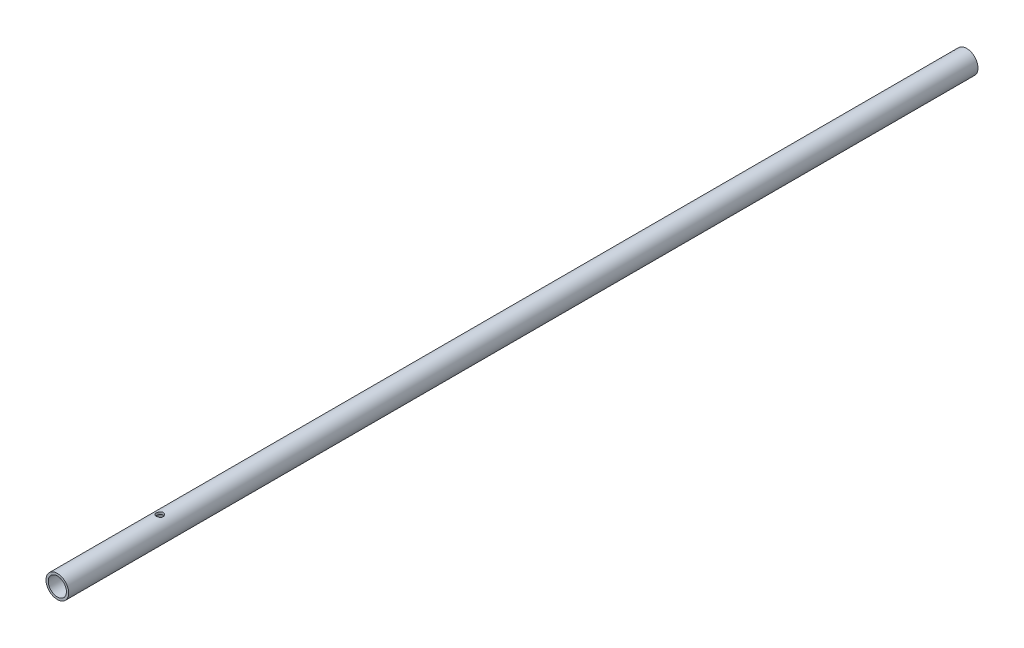
ISO-10303-21;
HEADER;
FILE_DESCRIPTION(('STEP AP214'),'2;1');
FILE_NAME('part.step','',(''),(''),'','','');
FILE_SCHEMA(('AUTOMOTIVE_DESIGN { 1 0 10303 214 1 1 1 1 }'));
ENDSEC;
DATA;
#1=APPLICATION_CONTEXT('core data for automotive mechanical design processes');
#2=APPLICATION_PROTOCOL_DEFINITION('international standard','automotive_design',2000,#1);
#3=PRODUCT_CONTEXT('',#1,'mechanical');
#4=PRODUCT('Part','Part','',(#3));
#5=PRODUCT_RELATED_PRODUCT_CATEGORY('part','',(#4));
#6=PRODUCT_DEFINITION_FORMATION('','',#4);
#7=PRODUCT_DEFINITION_CONTEXT('part definition',#1,'design');
#8=PRODUCT_DEFINITION('design','',#6,#7);
#9=PRODUCT_DEFINITION_SHAPE('','',#8);
#10=(LENGTH_UNIT() NAMED_UNIT(*) SI_UNIT(.MILLI.,.METRE.));
#11=(NAMED_UNIT(*) PLANE_ANGLE_UNIT() SI_UNIT($,.RADIAN.));
#12=(NAMED_UNIT(*) SI_UNIT($,.STERADIAN.) SOLID_ANGLE_UNIT());
#13=UNCERTAINTY_MEASURE_WITH_UNIT(LENGTH_MEASURE(1.E-05),#10,'distance_accuracy_value','');
#14=(GEOMETRIC_REPRESENTATION_CONTEXT(3) GLOBAL_UNCERTAINTY_ASSIGNED_CONTEXT((#13)) GLOBAL_UNIT_ASSIGNED_CONTEXT((#10,
#11,#12)) REPRESENTATION_CONTEXT('',''));
#15=CARTESIAN_POINT('',(0.,0.,0.));
#16=DIRECTION('',(0.,0.,1.));
#17=DIRECTION('',(1.,0.,0.));
#18=AXIS2_PLACEMENT_3D('',#15,#16,#17);
#19=CARTESIAN_POINT('',(0.,0.,400.));
#20=DIRECTION('',(0.,0.,-1.));
#21=DIRECTION('',(-1.,0.,0.));
#22=AXIS2_PLACEMENT_3D('',#19,#20,#21);
#23=CYLINDRICAL_SURFACE('',#22,5.);
#24=CARTESIAN_POINT('',(0.,-5.,32.8344084314313));
#25=CARTESIAN_POINT('',(0.0822886127559416,-4.9999992925055,32.8344074339464));
#26=CARTESIAN_POINT('',(0.16458731835681,-4.9979491569394,32.8276145678071));
#27=CARTESIAN_POINT('',(0.326788125315354,-4.98997105593627,32.8006870772081));
#28=CARTESIAN_POINT('',(0.406689504424447,-4.9840419338959,32.7805484734063));
#29=CARTESIAN_POINT('',(0.561732707772502,-4.96895552501637,32.7276624145178));
#30=CARTESIAN_POINT('',(0.636881364415743,-4.95980300250167,32.6949335618081));
#31=CARTESIAN_POINT('',(0.780624181078093,-4.93922109237254,32.6178723383689));
#32=CARTESIAN_POINT('',(0.849217467496828,-4.92779140191602,32.5735384240281));
#33=CARTESIAN_POINT('',(0.979871797215218,-4.90350737192149,32.4731844239477));
#34=CARTESIAN_POINT('',(1.04171807127791,-4.89062383656324,32.4168918055327));
#35=CARTESIAN_POINT('',(1.1552492092707,-4.86505834209555,32.2947992015046));
#36=CARTESIAN_POINT('',(1.20693236331366,-4.85237641723527,32.2289976192878));
#37=CARTESIAN_POINT('',(1.29980037727968,-4.82834113992627,32.0879376783705));
#38=CARTESIAN_POINT('',(1.34072309026627,-4.81702406662648,32.0124999704149));
#39=CARTESIAN_POINT('',(1.40921394779434,-4.79743620392659,31.85541917717));
#40=CARTESIAN_POINT('',(1.43678529924754,-4.78916468311877,31.7737775874695));
#41=CARTESIAN_POINT('',(1.4770163368759,-4.77690870836908,31.6090181652614));
#42=CARTESIAN_POINT('',(1.4900719623967,-4.77281069322975,31.5260056875251));
#43=CARTESIAN_POINT('',(1.50213730619726,-4.76902789748175,31.3588752751668));
#44=CARTESIAN_POINT('',(1.5011504276614,-4.76934204758978,31.2747576133216));
#45=CARTESIAN_POINT('',(1.48546977204844,-4.77424744066212,31.1110245227669));
#46=CARTESIAN_POINT('',(1.47127205267687,-4.77868388597601,31.0313561810107));
#47=CARTESIAN_POINT('',(1.43037420431961,-4.7910835622716,30.8755886450947));
#48=CARTESIAN_POINT('',(1.4036728414648,-4.79904714130936,30.7994898039914));
#49=CARTESIAN_POINT('',(1.33816026658355,-4.81772733073676,30.6518080817004));
#50=CARTESIAN_POINT('',(1.29918816939214,-4.82848016114723,30.5803013474035));
#51=CARTESIAN_POINT('',(1.21035222593019,-4.85150986998984,30.4446764093442));
#52=CARTESIAN_POINT('',(1.16048574006791,-4.8637871174599,30.3805600019385));
#53=CARTESIAN_POINT('',(1.0488129076943,-4.88911011297106,30.258722240586));
#54=CARTESIAN_POINT('',(0.986594907503921,-4.90216654309757,30.2013797673162));
#55=CARTESIAN_POINT('',(0.853263259346794,-4.92712244062693,30.0978544472777));
#56=CARTESIAN_POINT('',(0.782149051891485,-4.93902183517929,30.0516723029258));
#57=CARTESIAN_POINT('',(0.63235503836856,-4.96043160069146,29.9715485088722));
#58=CARTESIAN_POINT('',(0.55362774977109,-4.96992543668061,29.9376909150857));
#59=CARTESIAN_POINT('',(0.391245415621183,-4.98533521832088,29.8838088412335));
#60=CARTESIAN_POINT('',(0.307591751604387,-4.99125216186913,29.8637805027997));
#61=CARTESIAN_POINT('',(0.140952242677567,-4.99868364643517,29.8387562534315));
#62=CARTESIAN_POINT('',(0.0580500976077211,-5.00034850417787,29.8332468455288));
#63=CARTESIAN_POINT('',(-0.107499605822289,-4.99952923241766,29.8359775870421));
#64=CARTESIAN_POINT('',(-0.190147196692424,-4.99704565677755,29.8442159009814));
#65=CARTESIAN_POINT('',(-0.350903605316557,-4.98830696987119,29.8737930424419));
#66=CARTESIAN_POINT('',(-0.429072772623513,-4.9821382979934,29.8948318189117));
#67=CARTESIAN_POINT('',(-0.580754638968729,-4.9667434784137,29.9490516641101));
#68=CARTESIAN_POINT('',(-0.654266777042172,-4.95751696320869,29.9822341923705));
#69=CARTESIAN_POINT('',(-0.796437189482378,-4.93669654350984,30.0606615968156));
#70=CARTESIAN_POINT('',(-0.864943826223342,-4.92505280829262,30.1061677722836));
#71=CARTESIAN_POINT('',(-0.993523308008304,-4.9007346876375,30.207633185391));
#72=CARTESIAN_POINT('',(-1.05359403238623,-4.88806004430429,30.2635950432273));
#73=CARTESIAN_POINT('',(-1.16585744554482,-4.86253171868313,30.3867957397124));
#74=CARTESIAN_POINT('',(-1.21768481235166,-4.8496882503235,30.4543703071168));
#75=CARTESIAN_POINT('',(-1.30928995076197,-4.82576515237369,30.597536370363));
#76=CARTESIAN_POINT('',(-1.34906803833687,-4.81468547653471,30.6731276559101));
#77=CARTESIAN_POINT('',(-1.41517347131687,-4.79567189613723,30.8299409226116));
#78=CARTESIAN_POINT('',(-1.441563469417,-4.78772337842427,30.9111346178962));
#79=CARTESIAN_POINT('',(-1.48021730819977,-4.77591594361287,31.0770964002966));
#80=CARTESIAN_POINT('',(-1.49248598983725,-4.77205562506754,31.1618632521557));
#81=CARTESIAN_POINT('',(-1.50221984490113,-4.76899972494495,31.3287699497499));
#82=CARTESIAN_POINT('',(-1.50028055313576,-4.76961647441154,31.4108720823939));
#83=CARTESIAN_POINT('',(-1.48307505449922,-4.77499401286707,31.5735225347544));
#84=CARTESIAN_POINT('',(-1.46780938129816,-4.77975463590985,31.6540709165606));
#85=CARTESIAN_POINT('',(-1.42476888809181,-4.79275763668886,31.8103538305322));
#86=CARTESIAN_POINT('',(-1.3971517551207,-4.8009560454451,31.8861357187535));
#87=CARTESIAN_POINT('',(-1.33031507126012,-4.81990278907789,32.0320508702142));
#88=CARTESIAN_POINT('',(-1.29109329967683,-4.83065161193028,32.1021830490396));
#89=CARTESIAN_POINT('',(-1.20048763809684,-4.85397676424694,32.2375715479307));
#90=CARTESIAN_POINT('',(-1.14871276097482,-4.8666054016274,32.3025571926664));
#91=CARTESIAN_POINT('',(-1.03517434633989,-4.89201320449137,32.4231109297184));
#92=CARTESIAN_POINT('',(-0.973408217174995,-4.90479240823104,32.4786765708805));
#93=CARTESIAN_POINT('',(-0.839465762220022,-4.92950936570026,32.580431843712));
#94=CARTESIAN_POINT('',(-0.767037885825208,-4.94141159765141,32.6262998782746));
#95=CARTESIAN_POINT('',(-0.615141374013429,-4.96260680455446,32.7051436013268));
#96=CARTESIAN_POINT('',(-0.535676053026328,-4.97190099930776,32.738125319699));
#97=CARTESIAN_POINT('',(-0.380757712676125,-4.98602174969148,32.7873037070804));
#98=CARTESIAN_POINT('',(-0.30578696197103,-4.99122027380971,32.8049201043123));
#99=CARTESIAN_POINT('',(-0.153880195239277,-4.99820944494472,32.8284719566724));
#100=CARTESIAN_POINT('',(-0.0769445098623873,-5.0000006615474,32.8344093641361));
#101=CARTESIAN_POINT('',(0.,-5.,32.8344084314313));
#102=B_SPLINE_CURVE_WITH_KNOTS('',3,(#24,#25,#26,#27,#28,#29,#30,#31,#32,#33,#34,#35,#36,#37,
#38,#39,#40,#41,#42,#43,#44,#45,#46,#47,#48,#49,#50,#51,#52,#53,#54,#55,#56,#57,#58,#59,#60,#61,
#62,#63,#64,#65,#66,#67,#68,#69,#70,#71,#72,#73,#74,#75,#76,#77,#78,#79,#80,#81,#82,#83,#84,#85,
#86,#87,#88,#89,#90,#91,#92,#93,#94,#95,#96,#97,#98,#99,#100,#101),.UNSPECIFIED.,.T.,.F.,(4,2,2,
2,2,2,2,2,2,2,2,2,2,2,2,2,2,2,2,2,2,2,2,2,2,2,2,2,2,2,2,2,2,2,2,2,2,2,4),(0.,0.24658320362052,
0.493239964861809,0.739533676324558,0.985860164444261,1.23855602952195,1.49129437293484,
1.7497148100987,2.00807314549895,2.25919689364112,2.51025978327442,2.75226016706772,
2.99428443667839,3.23962426457728,3.48502360169935,3.74067104060422,3.99633456544203,
4.25371046895724,4.51101453543746,4.75908809454297,5.00712853566892,5.24956746699643,
5.49203554611796,5.74011305721769,5.98825282019846,6.24540400343361,6.50254844274111,
6.75847814973581,7.01432009483509,7.25950155490956,7.504673196864,7.74680040428258,
7.98897397579381,8.2399692570702,8.49102974925408,8.74942996185483,9.00770911624955,
9.23831691961452,9.46888616981139),.UNSPECIFIED.);
#103=CARTESIAN_POINT('',(0.,-5.,32.8344084314313));
#104=VERTEX_POINT('',#103);
#105=EDGE_CURVE('E68',#104,#104,#102,.T.);
#106=ORIENTED_EDGE('',*,*,#105,.T.);
#107=EDGE_LOOP('',(#106));
#108=FACE_BOUND('',#107,.T.);
#109=CARTESIAN_POINT('',(0.,0.,400.));
#110=DIRECTION('',(0.,0.,1.));
#111=DIRECTION('',(1.,0.,0.));
#112=AXIS2_PLACEMENT_3D('',#109,#110,#111);
#113=CIRCLE('',#112,5.);
#114=CARTESIAN_POINT('',(5.,0.,400.));
#115=VERTEX_POINT('',#114);
#116=EDGE_CURVE('E10',#115,#115,#113,.T.);
#117=ORIENTED_EDGE('',*,*,#116,.F.);
#118=EDGE_LOOP('',(#117));
#119=FACE_BOUND('',#118,.T.);
#120=CARTESIAN_POINT('',(0.,0.,0.));
#121=DIRECTION('',(0.,0.,1.));
#122=DIRECTION('',(1.,0.,0.));
#123=AXIS2_PLACEMENT_3D('',#120,#121,#122);
#124=CIRCLE('',#123,5.);
#125=CARTESIAN_POINT('',(5.,0.,0.));
#126=VERTEX_POINT('',#125);
#127=EDGE_CURVE('E52',#126,#126,#124,.T.);
#128=ORIENTED_EDGE('',*,*,#127,.T.);
#129=EDGE_LOOP('',(#128));
#130=FACE_BOUND('',#129,.T.);
#131=CARTESIAN_POINT('',(0.,5.,353.5));
#132=CARTESIAN_POINT('',(-0.0822886127533016,4.9999992925055,353.500000997485));
#133=CARTESIAN_POINT('',(-0.164587318351532,4.99794915693954,353.506793863624));
#134=CARTESIAN_POINT('',(-0.326788125304881,4.98997105593691,353.533721354222));
#135=CARTESIAN_POINT('',(-0.406689504411417,4.98404193389692,353.553859958023));
#136=CARTESIAN_POINT('',(-0.561732707754523,4.96895552501836,353.60674601691));
#137=CARTESIAN_POINT('',(-0.636881364395372,4.95980300250425,353.639474869619));
#138=CARTESIAN_POINT('',(-0.780624181053131,4.93922109237645,353.716536093056));
#139=CARTESIAN_POINT('',(-0.849217467469667,4.92779140192067,353.760870007395));
#140=CARTESIAN_POINT('',(-0.979871797183748,4.90350737192774,353.861224007473));
#141=CARTESIAN_POINT('',(-1.04171807124435,4.89062383657036,353.917516625886));
#142=CARTESIAN_POINT('',(-1.15524920923325,4.86505834210442,354.03960922991));
#143=CARTESIAN_POINT('',(-1.20693236327442,4.85237641724501,354.105410812125));
#144=CARTESIAN_POINT('',(-1.29980037723708,4.82834113993772,354.246470753038));
#145=CARTESIAN_POINT('',(-1.34072309022213,4.81702406663875,354.321908460991));
#146=CARTESIAN_POINT('',(-1.40921394774758,4.79743620394032,354.47898925423));
#147=CARTESIAN_POINT('',(-1.43678529919972,4.78916468313311,354.560630843928));
#148=CARTESIAN_POINT('',(-1.47701633682652,4.77690870838434,354.72539026613));
#149=CARTESIAN_POINT('',(-1.49007196234678,4.77281069324533,354.808402743864));
#150=CARTESIAN_POINT('',(-1.50213730614672,4.76902789749767,354.975533156217));
#151=CARTESIAN_POINT('',(-1.50115042761078,4.76934204760571,355.059650818059));
#152=CARTESIAN_POINT('',(-1.48546977199811,4.77424744067778,355.223383908608));
#153=CARTESIAN_POINT('',(-1.47127205262685,4.77868388599141,355.303052250362));
#154=CARTESIAN_POINT('',(-1.43037420427055,4.79108356228624,355.458819786273));
#155=CARTESIAN_POINT('',(-1.4036728414164,4.79904714132351,355.534918627374));
#156=CARTESIAN_POINT('',(-1.3381602665368,4.81772733074973,355.682600349661));
#157=CARTESIAN_POINT('',(-1.29918816934641,4.82848016115953,355.754107083955));
#158=CARTESIAN_POINT('',(-1.21035222588682,4.85150987000065,355.88973202201));
#159=CARTESIAN_POINT('',(-1.16048574002588,4.86378711746991,355.953848429414));
#160=CARTESIAN_POINT('',(-1.04881290765546,4.88911011297937,356.075686190762));
#161=CARTESIAN_POINT('',(-0.98659490746696,4.90216654310498,356.13302866403));
#162=CARTESIAN_POINT('',(-0.853263259313964,4.92712244063259,356.236553984064));
#163=CARTESIAN_POINT('',(-0.782149051860902,4.9390218351841,356.282736128414));
#164=CARTESIAN_POINT('',(-0.632355038342826,4.9604316006947,356.362859922465));
#165=CARTESIAN_POINT('',(-0.553627749747965,4.96992543668314,356.39671751625));
#166=CARTESIAN_POINT('',(-0.391245415603524,4.98533521832222,356.4505995901));
#167=CARTESIAN_POINT('',(-0.307591751589584,4.99125216186999,356.470627928532));
#168=CARTESIAN_POINT('',(-0.140952242668334,4.99868364643538,356.495652177899));
#169=CARTESIAN_POINT('',(-0.058050097601192,5.0003485041779,356.501161585802));
#170=CARTESIAN_POINT('',(0.107499605823375,4.9995292324176,356.498430844288));
#171=CARTESIAN_POINT('',(0.190147196690773,4.99704565677756,356.490192530349));
#172=CARTESIAN_POINT('',(0.350903605309678,4.98830696987163,356.460615388889));
#173=CARTESIAN_POINT('',(0.429072772614139,4.98213829799417,356.439576612419));
#174=CARTESIAN_POINT('',(0.580754638954494,4.96674347841533,356.385356767222));
#175=CARTESIAN_POINT('',(0.654266777025569,4.95751696321085,356.352174238962));
#176=CARTESIAN_POINT('',(0.796437189461043,4.93669654351325,356.273746834519));
#177=CARTESIAN_POINT('',(0.864943826199653,4.92505280829675,356.228240659052));
#178=CARTESIAN_POINT('',(0.993523307980123,4.90073468764318,356.126775245947));
#179=CARTESIAN_POINT('',(1.05359403235591,4.8880600443108,356.070813388112));
#180=CARTESIAN_POINT('',(1.16585744551025,4.86253171869138,355.947612691631));
#181=CARTESIAN_POINT('',(1.21768481231502,4.84968825033268,355.880038124228));
#182=CARTESIAN_POINT('',(1.30928995072152,4.82576515238464,355.736872060986));
#183=CARTESIAN_POINT('',(1.34906803829472,4.81468547654651,355.661280775442));
#184=CARTESIAN_POINT('',(1.41517347127168,4.79567189615055,355.504467508745));
#185=CARTESIAN_POINT('',(1.44156346937049,4.78772337843827,355.423273813463));
#186=CARTESIAN_POINT('',(1.48021730815114,4.77591594362794,355.257312031069));
#187=CARTESIAN_POINT('',(1.49248598978779,4.772055625083,355.172545179212));
#188=CARTESIAN_POINT('',(1.50221984485059,4.76899972496087,355.005638481624));
#189=CARTESIAN_POINT('',(1.5002805530849,4.76961647442754,354.923536348982));
#190=CARTESIAN_POINT('',(1.48307505444814,4.77499401288294,354.760885896627));
#191=CARTESIAN_POINT('',(1.46780938124717,4.77975463592551,354.680337514824));
#192=CARTESIAN_POINT('',(1.42476888804137,4.79275763670385,354.524054600857));
#193=CARTESIAN_POINT('',(1.3971517550707,4.80095604545964,354.448272712638));
#194=CARTESIAN_POINT('',(1.3303150712113,4.81990278909136,354.302357561182));
#195=CARTESIAN_POINT('',(1.29109329962878,4.83065161194311,354.232225382359));
#196=CARTESIAN_POINT('',(1.20048763805074,4.85397676425832,354.096836883473));
#197=CARTESIAN_POINT('',(1.14871276092996,4.86660540163797,354.03185123874));
#198=CARTESIAN_POINT('',(1.03517434629783,4.89201320450026,353.911297501692));
#199=CARTESIAN_POINT('',(0.973408217134497,4.90479240823905,353.855731860532));
#200=CARTESIAN_POINT('',(0.839465762183241,4.92950936570649,353.753976587705));
#201=CARTESIAN_POINT('',(0.767037885790608,4.94141159765674,353.708108553144));
#202=CARTESIAN_POINT('',(0.615141373983534,4.96260680455813,353.629264830096));
#203=CARTESIAN_POINT('',(0.535676052998955,4.97190099931066,353.596283111725));
#204=CARTESIAN_POINT('',(0.380757712655281,4.98602174969301,353.547104724347));
#205=CARTESIAN_POINT('',(0.305786961954236,4.99122027381068,353.529488327117));
#206=CARTESIAN_POINT('',(0.153880195230782,4.99820944494492,353.505936474758));
#207=CARTESIAN_POINT('',(0.0769445098581405,5.0000006615474,353.499999067295));
#208=CARTESIAN_POINT('',(0.,5.,353.5));
#209=B_SPLINE_CURVE_WITH_KNOTS('',3,(#131,#132,#133,#134,#135,#136,#137,#138,#139,#140,#141,
#142,#143,#144,#145,#146,#147,#148,#149,#150,#151,#152,#153,#154,#155,#156,#157,#158,#159,#160,
#161,#162,#163,#164,#165,#166,#167,#168,#169,#170,#171,#172,#173,#174,#175,#176,#177,#178,#179,
#180,#181,#182,#183,#184,#185,#186,#187,#188,#189,#190,#191,#192,#193,#194,#195,#196,#197,#198,
#199,#200,#201,#202,#203,#204,#205,#206,#207,#208),.UNSPECIFIED.,.T.,.F.,(4,2,2,2,2,2,2,2,2,2,2,
2,2,2,2,2,2,2,2,2,2,2,2,2,2,2,2,2,2,2,2,2,2,2,2,2,2,2,4),(0.,0.246583203612611,
0.493239964845996,0.739533676300865,0.985860164412719,1.23855602948197,1.49129437288633,
1.74971481004108,2.0080731454322,2.25919689356603,2.51025978319092,2.75226016697681,
2.99428443658007,3.23962426447124,3.48502360158558,3.74067104048168,3.9963345653107,
4.25371046881688,4.51101453528809,4.75908809438545,5.00712853550325,5.24956746682325,
5.49203554593727,5.74011305702906,5.98825282000187,6.24540400322818,6.50254844252682,
6.7584781495125,7.01432009460278,7.25950155466941,7.50467319661597,7.74680040402722,
7.98897397553106,8.23996925679932,8.49102974897506,8.74942996156673,9.00770911595236,
9.23831691930462,9.46888616948876),.UNSPECIFIED.);
#210=CARTESIAN_POINT('',(0.,5.,353.5));
#211=VERTEX_POINT('',#210);
#212=EDGE_CURVE('E69',#211,#211,#209,.T.);
#213=ORIENTED_EDGE('',*,*,#212,.F.);
#214=EDGE_LOOP('',(#213));
#215=FACE_BOUND('',#214,.T.);
#216=ADVANCED_FACE('F39',(#108,#119,#130,#215),#23,.T.);
#217=CARTESIAN_POINT('',(0.,0.,400.));
#218=DIRECTION('',(0.,0.,-1.));
#219=DIRECTION('',(-1.,0.,0.));
#220=AXIS2_PLACEMENT_3D('',#217,#218,#219);
#221=CYLINDRICAL_SURFACE('',#220,4.);
#222=CARTESIAN_POINT('',(0.,0.,0.));
#223=DIRECTION('',(0.,0.,1.));
#224=DIRECTION('',(1.,0.,0.));
#225=AXIS2_PLACEMENT_3D('',#222,#223,#224);
#226=CIRCLE('',#225,4.);
#227=CARTESIAN_POINT('',(4.,0.,0.));
#228=VERTEX_POINT('',#227);
#229=EDGE_CURVE('E60',#228,#228,#226,.T.);
#230=ORIENTED_EDGE('',*,*,#229,.F.);
#231=EDGE_LOOP('',(#230));
#232=FACE_BOUND('',#231,.T.);
#233=CARTESIAN_POINT('',(0.,0.,400.));
#234=DIRECTION('',(0.,0.,1.));
#235=DIRECTION('',(1.,0.,0.));
#236=AXIS2_PLACEMENT_3D('',#233,#234,#235);
#237=CIRCLE('',#236,4.);
#238=CARTESIAN_POINT('',(4.,0.,400.));
#239=VERTEX_POINT('',#238);
#240=EDGE_CURVE('E57',#239,#239,#237,.T.);
#241=ORIENTED_EDGE('',*,*,#240,.T.);
#242=EDGE_LOOP('',(#241));
#243=FACE_BOUND('',#242,.T.);
#244=CARTESIAN_POINT('',(0.,-4.,32.8344084314313));
#245=CARTESIAN_POINT('',(0.0812350589403938,-4.00000217456151,32.8344113337344));
#246=CARTESIAN_POINT('',(0.162450241786868,-3.99750379283169,32.8277886711827));
#247=CARTESIAN_POINT('',(0.322453452362419,-3.98778696006851,32.8015802361604));
#248=CARTESIAN_POINT('',(0.401241828000123,-3.98056918893872,32.7819963309592));
#249=CARTESIAN_POINT('',(0.554060785008123,-3.96218832391308,32.7306554296566));
#250=CARTESIAN_POINT('',(0.628100224181811,-3.95103284349134,32.6989219146057));
#251=CARTESIAN_POINT('',(0.769799310184181,-3.92588767764888,32.6243020184096));
#252=CARTESIAN_POINT('',(0.83745723920391,-3.91189723226994,32.58141264588));
#253=CARTESIAN_POINT('',(0.967346417076076,-3.88186246970467,32.4837959003505));
#254=CARTESIAN_POINT('',(1.02927073018353,-3.86576002582708,32.4286781691604));
#255=CARTESIAN_POINT('',(1.14324421477987,-3.83360220870249,32.3089979967574));
#256=CARTESIAN_POINT('',(1.19529036363007,-3.81754685133844,32.2444326753264));
#257=CARTESIAN_POINT('',(1.28998202220142,-3.78662470616318,32.1046909638866));
#258=CARTESIAN_POINT('',(1.33219393200083,-3.77182648819293,32.0292040648615));
#259=CARTESIAN_POINT('',(1.40318646338694,-3.74599860235708,31.8715600772334));
#260=CARTESIAN_POINT('',(1.43197244965968,-3.73496742974069,31.7894056682439));
#261=CARTESIAN_POINT('',(1.47408431022456,-3.71854412822191,31.6242916911352));
#262=CARTESIAN_POINT('',(1.48799593223527,-3.71293924348846,31.5415033929552));
#263=CARTESIAN_POINT('',(1.50179556536696,-3.7073806145917,31.3745922733912));
#264=CARTESIAN_POINT('',(1.50168936807695,-3.70742453657253,31.2904700175077));
#265=CARTESIAN_POINT('',(1.4879042961507,-3.7129751163003,31.1286389061641));
#266=CARTESIAN_POINT('',(1.47503808514036,-3.71815468869126,31.0508475253306));
#267=CARTESIAN_POINT('',(1.43744167873295,-3.73284938057618,30.898621280965));
#268=CARTESIAN_POINT('',(1.41270969668176,-3.74236515297007,30.8241869247542));
#269=CARTESIAN_POINT('',(1.35163748576697,-3.76485702188533,30.6791313636355));
#270=CARTESIAN_POINT('',(1.31508648741815,-3.77789517986526,30.6086089452403));
#271=CARTESIAN_POINT('',(1.2315607376723,-3.80594210137854,30.4744626937664));
#272=CARTESIAN_POINT('',(1.18458238733325,-3.82095154455787,30.4108412538357));
#273=CARTESIAN_POINT('',(1.07781780770711,-3.85248038857951,30.2878047677002));
#274=CARTESIAN_POINT('',(1.01738298720949,-3.86903347454624,30.2289597906007));
#275=CARTESIAN_POINT('',(0.887312590855227,-3.90091728163266,30.1220704651388));
#276=CARTESIAN_POINT('',(0.817675603531524,-3.91624781465243,30.074027776737));
#277=CARTESIAN_POINT('',(0.66972343702197,-3.94426394808583,29.9894780342764));
#278=CARTESIAN_POINT('',(0.591290713871686,-3.95690498259219,29.9531608501162));
#279=CARTESIAN_POINT('',(0.428836850546068,-3.97778718326736,29.8944258270643));
#280=CARTESIAN_POINT('',(0.344818210864353,-3.98603030341339,29.8720018147721));
#281=CARTESIAN_POINT('',(0.17837524316166,-3.99684443228012,29.8427856437895));
#282=CARTESIAN_POINT('',(0.0961036195725312,-3.99969369025667,29.8352258249482));
#283=CARTESIAN_POINT('',(-0.0685724752501273,-4.0002589370014,29.83371736743));
#284=CARTESIAN_POINT('',(-0.150976912981228,-3.99797606386877,29.8397657110129));
#285=CARTESIAN_POINT('',(-0.310262048564834,-3.98871709772625,29.8647184736384));
#286=CARTESIAN_POINT('',(-0.387233328012687,-3.98192470962257,29.883119975067));
#287=CARTESIAN_POINT('',(-0.536941754967255,-3.96451477091586,29.9315945038778));
#288=CARTESIAN_POINT('',(-0.609678350359876,-3.95389672281844,29.961669049279));
#289=CARTESIAN_POINT('',(-0.75124776512712,-3.92949624407362,30.0335948437717));
#290=CARTESIAN_POINT('',(-0.819903083577067,-3.91563000208949,30.0757661605564));
#291=CARTESIAN_POINT('',(-0.949392711750359,-3.88626671564088,30.1703265345064));
#292=CARTESIAN_POINT('',(-1.01022412029634,-3.87076907008844,30.2227193638811));
#293=CARTESIAN_POINT('',(-1.12603079877491,-3.83873329490103,30.339812553463));
#294=CARTESIAN_POINT('',(-1.18046154126833,-3.82218696502724,30.4050506141132));
#295=CARTESIAN_POINT('',(-1.27771050035594,-3.79078815745613,30.544059816052));
#296=CARTESIAN_POINT('',(-1.32052767418407,-3.77593583193041,30.6178317227349));
#297=CARTESIAN_POINT('',(-1.39337773523257,-3.74966829820883,30.7724244181234));
#298=CARTESIAN_POINT('',(-1.42335685451347,-3.73826760326808,30.8532731772642));
#299=CARTESIAN_POINT('',(-1.46907883471606,-3.72054032889144,31.0194181950472));
#300=CARTESIAN_POINT('',(-1.48483050310371,-3.71421061055558,31.1047116675605));
#301=CARTESIAN_POINT('',(-1.50086347102847,-3.70775894790546,31.2714245909091));
#302=CARTESIAN_POINT('',(-1.50207331500907,-3.70726444521287,31.3527410630875));
#303=CARTESIAN_POINT('',(-1.49136715646744,-3.71158412743222,31.5143537476521));
#304=CARTESIAN_POINT('',(-1.47945239855295,-3.7163978089684,31.5946500560502));
#305=CARTESIAN_POINT('',(-1.44355815635419,-3.73048141583429,31.7494556581002));
#306=CARTESIAN_POINT('',(-1.41995798321694,-3.739610853747,31.8240667776312));
#307=CARTESIAN_POINT('',(-1.36169696785048,-3.76121548295988,31.9683139398848));
#308=CARTESIAN_POINT('',(-1.32703332950039,-3.77369151993424,32.0379487194627));
#309=CARTESIAN_POINT('',(-1.24552075943142,-3.80139723902331,32.1742352210949));
#310=CARTESIAN_POINT('',(-1.19812832807922,-3.81673698439424,32.2405392281995));
#311=CARTESIAN_POINT('',(-1.09334485734634,-3.84806246755836,32.3645499923755));
#312=CARTESIAN_POINT('',(-1.03595064017428,-3.86404840941909,32.4222540061933));
#313=CARTESIAN_POINT('',(-0.909080396827957,-3.89590424608873,32.5306103872332));
#314=CARTESIAN_POINT('',(-0.839118644254481,-3.91172104899759,32.5807121848485));
#315=CARTESIAN_POINT('',(-0.691213223238185,-3.94054514456379,32.6684310866949));
#316=CARTESIAN_POINT('',(-0.613268934125705,-3.9535522185102,32.7060472191569));
#317=CARTESIAN_POINT('',(-0.447999082030021,-3.97574292606378,32.7687852604736));
#318=CARTESIAN_POINT('',(-0.360413422256631,-3.98473657158166,32.7932954960294));
#319=CARTESIAN_POINT('',(-0.181875733617803,-3.99686242179547,32.8261013913512));
#320=CARTESIAN_POINT('',(-0.0909254163705649,-3.99999756603967,32.8344051829186));
#321=CARTESIAN_POINT('',(0.,-4.,32.8344084314313));
#322=B_SPLINE_CURVE_WITH_KNOTS('',3,(#244,#245,#246,#247,#248,#249,#250,#251,#252,#253,#254,
#255,#256,#257,#258,#259,#260,#261,#262,#263,#264,#265,#266,#267,#268,#269,#270,#271,#272,#273,
#274,#275,#276,#277,#278,#279,#280,#281,#282,#283,#284,#285,#286,#287,#288,#289,#290,#291,#292,
#293,#294,#295,#296,#297,#298,#299,#300,#301,#302,#303,#304,#305,#306,#307,#308,#309,#310,#311,
#312,#313,#314,#315,#316,#317,#318,#319,#320,#321),.UNSPECIFIED.,.T.,.F.,(4,2,2,2,2,2,2,2,2,2,2,
2,2,2,2,2,2,2,2,2,2,2,2,2,2,2,2,2,2,2,2,2,2,2,2,2,2,2,4),(0.,0.243369801568161,
0.486704549545644,0.729571369236305,0.972503379639779,1.22473618586582,1.47704604930327,
1.73896674507313,2.00078269358735,2.25185874424353,2.50283106088009,2.73878345128954,
2.97477138070254,3.21522408397397,3.45575990755351,3.71246153347785,3.96920257917918,
4.22991375299872,4.49050899713586,4.7372501965148,4.98393668406888,5.22114437940913,
5.45838293272232,5.70259221878121,5.94689180039134,6.20536519475808,6.46386178941177,
6.72343066749192,6.98283874979445,7.22558763503976,7.46831350235768,7.70363142451706,
7.93900886682341,8.18672471910863,8.43451942024412,8.69572329682314,8.95694749834305,
9.22948515062957,9.5018860182875),.UNSPECIFIED.);
#323=CARTESIAN_POINT('',(0.,-4.,32.8344084314313));
#324=VERTEX_POINT('',#323);
#325=EDGE_CURVE('E62',#324,#324,#322,.T.);
#326=ORIENTED_EDGE('',*,*,#325,.F.);
#327=EDGE_LOOP('',(#326));
#328=FACE_BOUND('',#327,.T.);
#329=CARTESIAN_POINT('',(0.,4.,353.5));
#330=CARTESIAN_POINT('',(-0.0812350589378502,4.00000217456151,353.499997097697));
#331=CARTESIAN_POINT('',(-0.162450241781789,3.99750379283184,353.506619760248));
#332=CARTESIAN_POINT('',(-0.322453452352359,3.98778696006928,353.53282819527));
#333=CARTESIAN_POINT('',(-0.401241827987614,3.98056918893993,353.552412100471));
#334=CARTESIAN_POINT('',(-0.554060784990868,3.96218832391545,353.603753001772));
#335=CARTESIAN_POINT('',(-0.628100224162258,3.9510328434944,353.635486516822));
#336=CARTESIAN_POINT('',(-0.769799310160236,3.92588767765353,353.710106413016));
#337=CARTESIAN_POINT('',(-0.837457239177872,3.91189723227548,353.752995785544));
#338=CARTESIAN_POINT('',(-0.967346417045827,3.88186246971217,353.850612531071));
#339=CARTESIAN_POINT('',(-1.02927073015119,3.86576002583566,353.905730262259));
#340=CARTESIAN_POINT('',(-1.14324421474363,3.83360220871327,354.025410434659));
#341=CARTESIAN_POINT('',(-1.19529036359202,3.81754685135033,354.089975756088));
#342=CARTESIAN_POINT('',(-1.28998202215985,3.78662470617732,354.229717467523));
#343=CARTESIAN_POINT('',(-1.3321939319576,3.77182648820818,354.305204366546));
#344=CARTESIAN_POINT('',(-1.40318646334085,3.74599860237433,354.462848354169));
#345=CARTESIAN_POINT('',(-1.43197244961239,3.73496742975881,354.545002763155));
#346=CARTESIAN_POINT('',(-1.47408431017549,3.71854412824136,354.710116740258));
#347=CARTESIAN_POINT('',(-1.48799593218558,3.71293924350838,354.792905038435));
#348=CARTESIAN_POINT('',(-1.50179556531648,3.70738061461215,354.959816157994));
#349=CARTESIAN_POINT('',(-1.50168936802631,3.70742453659305,355.043938413875));
#350=CARTESIAN_POINT('',(-1.48790429610018,3.71297511632055,355.205769525213));
#351=CARTESIAN_POINT('',(-1.47503808509004,3.71815468871121,355.283560906044));
#352=CARTESIAN_POINT('',(-1.43744167868331,3.73284938059529,355.435787150405));
#353=CARTESIAN_POINT('',(-1.41270969663259,3.74236515298863,355.510221506614));
#354=CARTESIAN_POINT('',(-1.35163748571905,3.76485702190253,355.655277067728));
#355=CARTESIAN_POINT('',(-1.31508648737101,3.77789517988165,355.725799486121));
#356=CARTESIAN_POINT('',(-1.23156073762698,3.80594210139319,355.859945737591));
#357=CARTESIAN_POINT('',(-1.18458238728898,3.82095154457157,355.92356717752));
#358=CARTESIAN_POINT('',(-1.0778178076655,3.85248038859113,356.046603663651));
#359=CARTESIAN_POINT('',(-1.01738298716956,3.8690334745567,356.105448640748));
#360=CARTESIAN_POINT('',(-0.887312590819023,3.90091728164085,356.212337966206));
#361=CARTESIAN_POINT('',(-0.817675603497362,3.91624781465952,356.260380654606));
#362=CARTESIAN_POINT('',(-0.669723436992423,3.9442639480908,356.344930397063));
#363=CARTESIAN_POINT('',(-0.591290713844732,3.95690498259616,356.381247581221));
#364=CARTESIAN_POINT('',(-0.428836850524603,3.97778718326962,356.43998260427));
#365=CARTESIAN_POINT('',(-0.344818210845783,3.98603030341493,356.462406616561));
#366=CARTESIAN_POINT('',(-0.178375243148679,3.99684443228065,356.491622787542));
#367=CARTESIAN_POINT('',(-0.0961036195622245,3.99969369025686,356.499182606383));
#368=CARTESIAN_POINT('',(0.0685724752550091,4.00025893700126,356.5006910639));
#369=CARTESIAN_POINT('',(0.150976912983359,3.99797606386863,356.494642720317));
#370=CARTESIAN_POINT('',(0.310262048561846,3.98871709772643,356.469689957691));
#371=CARTESIAN_POINT('',(0.387233328007322,3.98192470962305,356.451288456263));
#372=CARTESIAN_POINT('',(0.536941754957214,3.96451477091717,356.402813927453));
#373=CARTESIAN_POINT('',(0.609678350347535,3.9538967228203,356.372739382052));
#374=CARTESIAN_POINT('',(0.751247765110158,3.92949624407682,356.30081358756));
#375=CARTESIAN_POINT('',(0.819903083557791,3.91563000209348,356.258642270777));
#376=CARTESIAN_POINT('',(0.949392711726618,3.88626671564664,356.164081896828));
#377=CARTESIAN_POINT('',(1.01022412027045,3.87076907009516,356.111689067455));
#378=CARTESIAN_POINT('',(1.12603079874455,3.83873329490989,355.994595877876));
#379=CARTESIAN_POINT('',(1.18046154123569,3.82218696503729,355.929357817227));
#380=CARTESIAN_POINT('',(1.27771050031904,3.79078815746853,355.790348615292));
#381=CARTESIAN_POINT('',(1.32052767414519,3.77593583194399,355.716576708611));
#382=CARTESIAN_POINT('',(1.39337773518999,3.74966829822463,355.561984013228));
#383=CARTESIAN_POINT('',(1.42335685446919,3.73826760328493,355.48113525409));
#384=CARTESIAN_POINT('',(1.4690788346689,3.72054032891005,355.314990236312));
#385=CARTESIAN_POINT('',(1.48483050305535,3.71421061057491,355.229696763802));
#386=CARTESIAN_POINT('',(1.50086347097839,3.70775894792573,355.062983840459));
#387=CARTESIAN_POINT('',(1.50207331495837,3.70726444523341,354.981667368283));
#388=CARTESIAN_POINT('',(1.49136715641593,3.71158412745292,354.820054683724));
#389=CARTESIAN_POINT('',(1.47945239850124,3.71639780898898,354.739758375328));
#390=CARTESIAN_POINT('',(1.44355815630243,3.73048141585432,354.584952773283));
#391=CARTESIAN_POINT('',(1.41995798316526,3.73961085376662,354.510341653755));
#392=CARTESIAN_POINT('',(1.36169696779922,3.76121548297844,354.366094491506));
#393=CARTESIAN_POINT('',(1.32703332944947,3.77369151995214,354.29645971193));
#394=CARTESIAN_POINT('',(1.24552075938156,3.80139723903964,354.160173210302));
#395=CARTESIAN_POINT('',(1.19812832803012,3.81673698440964,354.0938692032));
#396=CARTESIAN_POINT('',(1.09334485729906,3.84806246757177,353.969858439029));
#397=CARTESIAN_POINT('',(1.03595064012808,3.86404840943145,353.912154425213));
#398=CARTESIAN_POINT('',(0.909080396784623,3.89590424609881,353.803798044178));
#399=CARTESIAN_POINT('',(0.839118644212997,3.91172104900644,353.753696246565));
#400=CARTESIAN_POINT('',(0.691213223200836,3.9405451445703,353.665977344723));
#401=CARTESIAN_POINT('',(0.613268934090639,3.95355221851559,353.628361212264));
#402=CARTESIAN_POINT('',(0.447999082002327,3.9757429260668,353.565623170952));
#403=CARTESIAN_POINT('',(0.360413422234217,3.98473657158356,353.541112935398));
#404=CARTESIAN_POINT('',(0.181875733606385,3.99686242179587,353.508307040079));
#405=CARTESIAN_POINT('',(0.0909254163648622,3.99999756603967,353.500003248513));
#406=CARTESIAN_POINT('',(0.,4.,353.5));
#407=B_SPLINE_CURVE_WITH_KNOTS('',3,(#329,#330,#331,#332,#333,#334,#335,#336,#337,#338,#339,
#340,#341,#342,#343,#344,#345,#346,#347,#348,#349,#350,#351,#352,#353,#354,#355,#356,#357,#358,
#359,#360,#361,#362,#363,#364,#365,#366,#367,#368,#369,#370,#371,#372,#373,#374,#375,#376,#377,
#378,#379,#380,#381,#382,#383,#384,#385,#386,#387,#388,#389,#390,#391,#392,#393,#394,#395,#396,
#397,#398,#399,#400,#401,#402,#403,#404,#405,#406),.UNSPECIFIED.,.T.,.F.,(4,2,2,2,2,2,2,2,2,2,2,
2,2,2,2,2,2,2,2,2,2,2,2,2,2,2,2,2,2,2,2,2,2,2,2,2,2,2,4),(0.,0.243369801560553,
0.486704549530461,0.729571369213556,0.97250337960949,1.22473618582714,1.47704604925623,
1.73896674501659,2.00078269352135,2.25185874416902,2.50283106079711,2.7387834511997,
2.97477138060587,3.21522408387019,3.45575990744259,3.71246153335813,3.96920257905066,
4.22991375286073,4.49050899698844,4.73725019635924,4.9839366839052,5.22114437923839,
5.45838293254453,5.702592218596,5.94689180019869,6.20536519455659,6.46386178920142,
6.72343066727207,6.98283874956508,7.22558763480247,7.46831350211249,7.70363142426527,
7.93900886656502,8.18672471884269,8.43451941997063,8.69572329654036,8.95694749805101,
9.2294851503204,9.50188601796127),.UNSPECIFIED.);
#408=CARTESIAN_POINT('',(0.,4.,353.5));
#409=VERTEX_POINT('',#408);
#410=EDGE_CURVE('E43',#409,#409,#407,.T.);
#411=ORIENTED_EDGE('',*,*,#410,.T.);
#412=EDGE_LOOP('',(#411));
#413=FACE_BOUND('',#412,.T.);
#414=ADVANCED_FACE('F70',(#232,#243,#328,#413),#221,.F.);
#415=CARTESIAN_POINT('',(0.,0.,400.));
#416=DIRECTION('',(0.,0.,1.));
#417=DIRECTION('',(1.,0.,0.));
#418=AXIS2_PLACEMENT_3D('',#415,#416,#417);
#419=PLANE('',#418);
#420=ORIENTED_EDGE('',*,*,#116,.T.);
#421=EDGE_LOOP('',(#420));
#422=FACE_BOUND('',#421,.T.);
#423=ORIENTED_EDGE('',*,*,#240,.F.);
#424=EDGE_LOOP('',(#423));
#425=FACE_BOUND('',#424,.T.);
#426=ADVANCED_FACE('F98',(#422,#425),#419,.T.);
#427=CARTESIAN_POINT('',(0.,0.,0.));
#428=DIRECTION('',(0.,0.,1.));
#429=DIRECTION('',(1.,0.,0.));
#430=AXIS2_PLACEMENT_3D('',#427,#428,#429);
#431=PLANE('',#430);
#432=ORIENTED_EDGE('',*,*,#127,.F.);
#433=EDGE_LOOP('',(#432));
#434=FACE_BOUND('',#433,.T.);
#435=ORIENTED_EDGE('',*,*,#229,.T.);
#436=EDGE_LOOP('',(#435));
#437=FACE_BOUND('',#436,.T.);
#438=ADVANCED_FACE('F77',(#434,#437),#431,.F.);
#439=CARTESIAN_POINT('',(0.,-5.,31.3344084313808));
#440=DIRECTION('',(0.,1.,0.));
#441=DIRECTION('',(0.,0.,1.));
#442=AXIS2_PLACEMENT_3D('',#439,#440,#441);
#443=CYLINDRICAL_SURFACE('',#442,1.5000000000505);
#444=ORIENTED_EDGE('',*,*,#325,.T.);
#445=EDGE_LOOP('',(#444));
#446=FACE_BOUND('',#445,.T.);
#447=ORIENTED_EDGE('',*,*,#105,.F.);
#448=EDGE_LOOP('',(#447));
#449=FACE_BOUND('',#448,.T.);
#450=ADVANCED_FACE('F73',(#446,#449),#443,.F.);
#451=CARTESIAN_POINT('',(0.,5.,355.));
#452=DIRECTION('',(0.,-1.,0.));
#453=DIRECTION('',(0.,0.,-1.));
#454=AXIS2_PLACEMENT_3D('',#451,#452,#453);
#455=CYLINDRICAL_SURFACE('',#454,1.5);
#456=ORIENTED_EDGE('',*,*,#410,.F.);
#457=EDGE_LOOP('',(#456));
#458=FACE_BOUND('',#457,.T.);
#459=ORIENTED_EDGE('',*,*,#212,.T.);
#460=EDGE_LOOP('',(#459));
#461=FACE_BOUND('',#460,.T.);
#462=ADVANCED_FACE('F76',(#458,#461),#455,.F.);
#463=CLOSED_SHELL('',(#216,#414,#426,#438,#450,#462));
#464=MANIFOLD_SOLID_BREP('B2',#463);
#465=ADVANCED_BREP_SHAPE_REPRESENTATION('',(#18,#464),#14);
#466=SHAPE_DEFINITION_REPRESENTATION(#9,#465);
ENDSEC;
END-ISO-10303-21;
